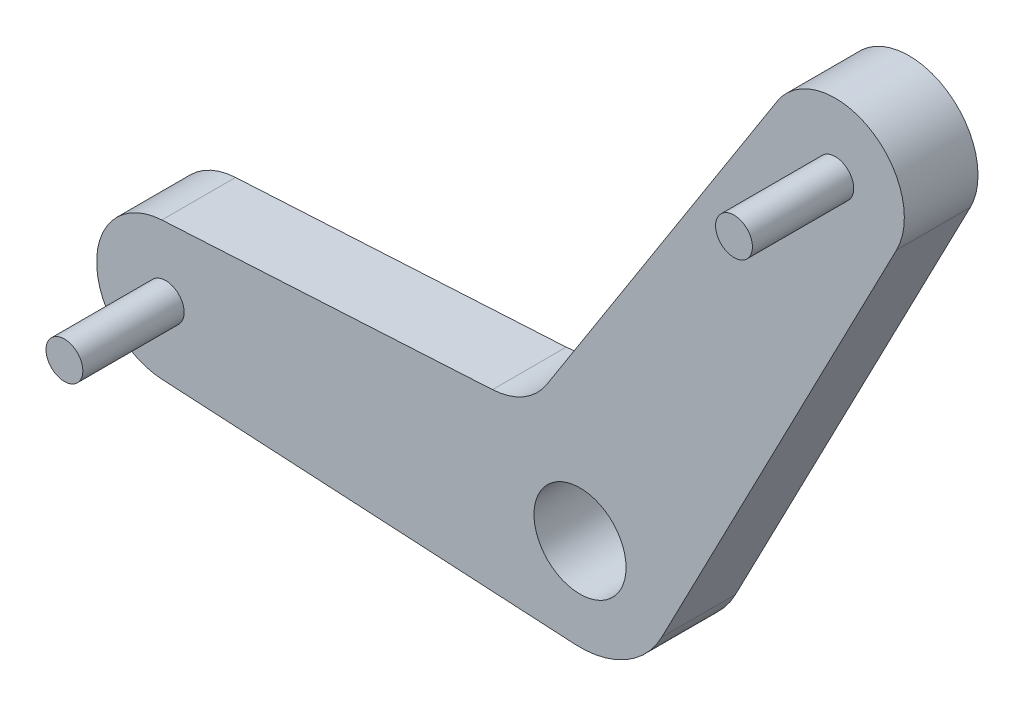
ISO-10303-21;
HEADER;
FILE_DESCRIPTION(('STEP AP214'),'2;1');
FILE_NAME('part.step','',(''),(''),'','','');
FILE_SCHEMA(('AUTOMOTIVE_DESIGN { 1 0 10303 214 1 1 1 1 }'));
ENDSEC;
DATA;
#1=APPLICATION_CONTEXT('core data for automotive mechanical design processes');
#2=APPLICATION_PROTOCOL_DEFINITION('international standard','automotive_design',2000,#1);
#3=PRODUCT_CONTEXT('',#1,'mechanical');
#4=PRODUCT('Part','Part','',(#3));
#5=PRODUCT_RELATED_PRODUCT_CATEGORY('part','',(#4));
#6=PRODUCT_DEFINITION_FORMATION('','',#4);
#7=PRODUCT_DEFINITION_CONTEXT('part definition',#1,'design');
#8=PRODUCT_DEFINITION('design','',#6,#7);
#9=PRODUCT_DEFINITION_SHAPE('','',#8);
#10=(LENGTH_UNIT() NAMED_UNIT(*) SI_UNIT(.MILLI.,.METRE.));
#11=(NAMED_UNIT(*) PLANE_ANGLE_UNIT() SI_UNIT($,.RADIAN.));
#12=(NAMED_UNIT(*) SI_UNIT($,.STERADIAN.) SOLID_ANGLE_UNIT());
#13=UNCERTAINTY_MEASURE_WITH_UNIT(LENGTH_MEASURE(1.E-05),#10,'distance_accuracy_value','');
#14=(GEOMETRIC_REPRESENTATION_CONTEXT(3) GLOBAL_UNCERTAINTY_ASSIGNED_CONTEXT((#13)) GLOBAL_UNIT_ASSIGNED_CONTEXT((#10,
#11,#12)) REPRESENTATION_CONTEXT('',''));
#15=CARTESIAN_POINT('',(0.,0.,0.));
#16=DIRECTION('',(0.,0.,1.));
#17=DIRECTION('',(1.,0.,0.));
#18=AXIS2_PLACEMENT_3D('',#15,#16,#17);
#19=CARTESIAN_POINT('',(-19.8391838862913,33.9502559764807,16.));
#20=DIRECTION('',(0.,0.,-1.));
#21=DIRECTION('',(-1.,0.,0.));
#22=AXIS2_PLACEMENT_3D('',#19,#20,#21);
#23=CYLINDRICAL_SURFACE('',#22,15.);
#24=CARTESIAN_POINT('',(-19.8391838862913,33.9502559764807,0.));
#25=DIRECTION('',(0.,0.,-1.));
#26=DIRECTION('',(-1.,0.,0.));
#27=AXIS2_PLACEMENT_3D('',#24,#25,#26);
#28=CIRCLE('',#27,15.);
#29=CARTESIAN_POINT('',(-7.20015490059572,25.8722026033748,0.));
#30=VERTEX_POINT('',#29);
#31=CARTESIAN_POINT('',(-19.005850552958,18.9734220134712,0.));
#32=VERTEX_POINT('',#31);
#33=EDGE_CURVE('E147',#30,#32,#28,.T.);
#34=ORIENTED_EDGE('',*,*,#33,.T.);
#35=DIRECTION('',(0.,0.,-1.));
#36=VECTOR('',#35,1.);
#37=CARTESIAN_POINT('',(-19.005850552958,18.9734220134712,16.));
#38=LINE('',#37,#36);
#39=CARTESIAN_POINT('',(-19.005850552958,18.9734220134712,16.));
#40=VERTEX_POINT('',#39);
#41=EDGE_CURVE('E189',#40,#32,#38,.T.);
#42=ORIENTED_EDGE('',*,*,#41,.F.);
#43=CARTESIAN_POINT('',(-19.8391838862913,33.9502559764807,16.));
#44=DIRECTION('',(0.,0.,-1.));
#45=DIRECTION('',(-1.,0.,0.));
#46=AXIS2_PLACEMENT_3D('',#43,#44,#45);
#47=CIRCLE('',#46,15.);
#48=CARTESIAN_POINT('',(-7.20015490059572,25.8722026033748,16.));
#49=VERTEX_POINT('',#48);
#50=EDGE_CURVE('E170',#49,#40,#47,.T.);
#51=ORIENTED_EDGE('',*,*,#50,.F.);
#52=DIRECTION('',(0.,0.,-1.));
#53=VECTOR('',#52,1.);
#54=CARTESIAN_POINT('',(-7.20015490059572,25.8722026033748,16.));
#55=LINE('',#54,#53);
#56=EDGE_CURVE('E143',#49,#30,#55,.T.);
#57=ORIENTED_EDGE('',*,*,#56,.T.);
#58=EDGE_LOOP('',(#34,#42,#51,#57));
#59=FACE_BOUND('',#58,.T.);
#60=ADVANCED_FACE('F45',(#59),#23,.F.);
#61=CARTESIAN_POINT('',(-90.8333333333333,14.9768339630095,16.));
#62=DIRECTION('',(0.0555555555555553,-0.998455597533968,0.));
#63=DIRECTION('',(0.998455597533968,0.0555555555555553,0.));
#64=AXIS2_PLACEMENT_3D('',#61,#62,#63);
#65=PLANE('',#64);
#66=DIRECTION('',(-0.998455597533968,-0.0555555555555553,0.));
#67=VECTOR('',#66,1.);
#68=CARTESIAN_POINT('',(-90.8333333333333,14.9768339630095,0.));
#69=LINE('',#68,#67);
#70=CARTESIAN_POINT('',(-90.8333333333333,14.9768339630095,0.));
#71=VERTEX_POINT('',#70);
#72=EDGE_CURVE('E151',#32,#71,#69,.T.);
#73=ORIENTED_EDGE('',*,*,#72,.T.);
#74=DIRECTION('',(0.,0.,-1.));
#75=VECTOR('',#74,1.);
#76=CARTESIAN_POINT('',(-90.8333333333333,14.9768339630095,16.));
#77=LINE('',#76,#75);
#78=CARTESIAN_POINT('',(-90.8333333333333,14.9768339630095,16.));
#79=VERTEX_POINT('',#78);
#80=EDGE_CURVE('E185',#79,#71,#77,.T.);
#81=ORIENTED_EDGE('',*,*,#80,.F.);
#82=DIRECTION('',(-0.998455597533968,-0.0555555555555553,0.));
#83=VECTOR('',#82,1.);
#84=CARTESIAN_POINT('',(-90.8333333333333,14.9768339630095,16.));
#85=LINE('',#84,#83);
#86=EDGE_CURVE('E106',#40,#79,#85,.T.);
#87=ORIENTED_EDGE('',*,*,#86,.F.);
#88=ORIENTED_EDGE('',*,*,#41,.T.);
#89=EDGE_LOOP('',(#73,#81,#87,#88));
#90=FACE_BOUND('',#89,.T.);
#91=ADVANCED_FACE('F214',(#90),#65,.F.);
#92=CARTESIAN_POINT('',(-90.,0.,16.));
#93=DIRECTION('',(0.,0.,-1.));
#94=DIRECTION('',(-1.,0.,0.));
#95=AXIS2_PLACEMENT_3D('',#92,#93,#94);
#96=CYLINDRICAL_SURFACE('',#95,15.);
#97=CARTESIAN_POINT('',(-90.,0.,0.));
#98=DIRECTION('',(0.,0.,1.));
#99=DIRECTION('',(1.,0.,0.));
#100=AXIS2_PLACEMENT_3D('',#97,#98,#99);
#101=CIRCLE('',#100,15.);
#102=CARTESIAN_POINT('',(-90.8333333333333,-14.9768339630095,0.));
#103=VERTEX_POINT('',#102);
#104=EDGE_CURVE('E155',#71,#103,#101,.T.);
#105=ORIENTED_EDGE('',*,*,#104,.T.);
#106=DIRECTION('',(0.,0.,-1.));
#107=VECTOR('',#106,1.);
#108=CARTESIAN_POINT('',(-90.8333333333333,-14.9768339630095,16.));
#109=LINE('',#108,#107);
#110=CARTESIAN_POINT('',(-90.8333333333333,-14.9768339630095,16.));
#111=VERTEX_POINT('',#110);
#112=EDGE_CURVE('E181',#111,#103,#109,.T.);
#113=ORIENTED_EDGE('',*,*,#112,.F.);
#114=CARTESIAN_POINT('',(-90.,0.,16.));
#115=DIRECTION('',(0.,0.,1.));
#116=DIRECTION('',(1.,0.,0.));
#117=AXIS2_PLACEMENT_3D('',#114,#115,#116);
#118=CIRCLE('',#117,15.);
#119=EDGE_CURVE('E229',#79,#111,#118,.T.);
#120=ORIENTED_EDGE('',*,*,#119,.F.);
#121=ORIENTED_EDGE('',*,*,#80,.T.);
#122=EDGE_LOOP('',(#105,#113,#120,#121));
#123=FACE_BOUND('',#122,.T.);
#124=ADVANCED_FACE('F219',(#123),#96,.T.);
#125=CARTESIAN_POINT('',(-90.8333333333333,-14.9768339630095,16.));
#126=DIRECTION('',(0.0555555555555556,0.998455597533968,0.));
#127=DIRECTION('',(-0.998455597533968,0.0555555555555556,0.));
#128=AXIS2_PLACEMENT_3D('',#125,#126,#127);
#129=PLANE('',#128);
#130=DIRECTION('',(0.998455597533968,-0.0555555555555556,0.));
#131=VECTOR('',#130,1.);
#132=CARTESIAN_POINT('',(-90.8333333333333,-14.9768339630095,0.));
#133=LINE('',#132,#131);
#134=CARTESIAN_POINT('',(-1.11111111111111,-19.9691119506794,0.));
#135=VERTEX_POINT('',#134);
#136=EDGE_CURVE('E158',#103,#135,#133,.T.);
#137=ORIENTED_EDGE('',*,*,#136,.T.);
#138=DIRECTION('',(0.,0.,-1.));
#139=VECTOR('',#138,1.);
#140=CARTESIAN_POINT('',(-1.11111111111111,-19.9691119506794,16.));
#141=LINE('',#140,#139);
#142=CARTESIAN_POINT('',(-1.11111111111111,-19.9691119506794,16.));
#143=VERTEX_POINT('',#142);
#144=EDGE_CURVE('E177',#143,#135,#141,.T.);
#145=ORIENTED_EDGE('',*,*,#144,.F.);
#146=DIRECTION('',(0.998455597533968,-0.0555555555555556,0.));
#147=VECTOR('',#146,1.);
#148=CARTESIAN_POINT('',(-90.8333333333333,-14.9768339630095,16.));
#149=LINE('',#148,#147);
#150=EDGE_CURVE('E232',#111,#143,#149,.T.);
#151=ORIENTED_EDGE('',*,*,#150,.F.);
#152=ORIENTED_EDGE('',*,*,#112,.T.);
#153=EDGE_LOOP('',(#137,#145,#151,#152));
#154=FACE_BOUND('',#153,.T.);
#155=ADVANCED_FACE('F340',(#154),#129,.F.);
#156=CARTESIAN_POINT('',(0.,0.,16.));
#157=DIRECTION('',(0.,0.,-1.));
#158=DIRECTION('',(-1.,0.,0.));
#159=AXIS2_PLACEMENT_3D('',#156,#157,#158);
#160=CYLINDRICAL_SURFACE('',#159,20.);
#161=CARTESIAN_POINT('',(0.,0.,0.));
#162=DIRECTION('',(0.,0.,1.));
#163=DIRECTION('',(1.,0.,0.));
#164=AXIS2_PLACEMENT_3D('',#161,#162,#163);
#165=CIRCLE('',#164,20.);
#166=CARTESIAN_POINT('',(17.7537519027789,-9.20892465896949,0.));
#167=VERTEX_POINT('',#166);
#168=EDGE_CURVE('E161',#135,#167,#165,.T.);
#169=ORIENTED_EDGE('',*,*,#168,.T.);
#170=DIRECTION('',(0.,0.,-1.));
#171=VECTOR('',#170,1.);
#172=CARTESIAN_POINT('',(17.7537519027789,-9.20892465896949,16.));
#173=LINE('',#172,#171);
#174=CARTESIAN_POINT('',(17.7537519027789,-9.20892465896949,16.));
#175=VERTEX_POINT('',#174);
#176=EDGE_CURVE('E136',#175,#167,#173,.T.);
#177=ORIENTED_EDGE('',*,*,#176,.F.);
#178=CARTESIAN_POINT('',(0.,0.,16.));
#179=DIRECTION('',(0.,0.,1.));
#180=DIRECTION('',(1.,0.,0.));
#181=AXIS2_PLACEMENT_3D('',#178,#179,#180);
#182=CIRCLE('',#181,20.);
#183=EDGE_CURVE('E125',#143,#175,#182,.T.);
#184=ORIENTED_EDGE('',*,*,#183,.F.);
#185=ORIENTED_EDGE('',*,*,#144,.T.);
#186=EDGE_LOOP('',(#169,#177,#184,#185));
#187=FACE_BOUND('',#186,.T.);
#188=ADVANCED_FACE('F332',(#187),#160,.T.);
#189=CARTESIAN_POINT('',(68.7653139270839,89.1355237854673,16.));
#190=DIRECTION('',(-0.887687595138943,0.460446232948474,0.));
#191=DIRECTION('',(-0.460446232948474,-0.887687595138943,0.));
#192=AXIS2_PLACEMENT_3D('',#189,#190,#191);
#193=PLANE('',#192);
#194=DIRECTION('',(0.460446232948474,0.887687595138943,0.));
#195=VECTOR('',#194,1.);
#196=CARTESIAN_POINT('',(68.7653139270839,89.1355237854673,0.));
#197=LINE('',#196,#195);
#198=CARTESIAN_POINT('',(68.7653139270839,89.1355237854673,0.));
#199=VERTEX_POINT('',#198);
#200=EDGE_CURVE('E134',#167,#199,#197,.T.);
#201=ORIENTED_EDGE('',*,*,#200,.T.);
#202=DIRECTION('',(0.,0.,-1.));
#203=VECTOR('',#202,1.);
#204=CARTESIAN_POINT('',(68.7653139270839,89.1355237854673,16.));
#205=LINE('',#204,#203);
#206=CARTESIAN_POINT('',(68.7653139270839,89.1355237854673,16.));
#207=VERTEX_POINT('',#206);
#208=EDGE_CURVE('E131',#207,#199,#205,.T.);
#209=ORIENTED_EDGE('',*,*,#208,.F.);
#210=DIRECTION('',(0.460446232948474,0.887687595138943,0.));
#211=VECTOR('',#210,1.);
#212=CARTESIAN_POINT('',(68.7653139270839,89.1355237854673,16.));
#213=LINE('',#212,#211);
#214=EDGE_CURVE('E119',#175,#207,#213,.T.);
#215=ORIENTED_EDGE('',*,*,#214,.F.);
#216=ORIENTED_EDGE('',*,*,#176,.T.);
#217=EDGE_LOOP('',(#201,#209,#215,#216));
#218=FACE_BOUND('',#217,.T.);
#219=ADVANCED_FACE('F132',(#218),#193,.F.);
#220=CARTESIAN_POINT('',(55.4499999999997,96.0422172796944,16.));
#221=DIRECTION('',(0.,0.,-1.));
#222=DIRECTION('',(-1.,0.,0.));
#223=AXIS2_PLACEMENT_3D('',#220,#221,#222);
#224=CYLINDRICAL_SURFACE('',#223,15.);
#225=CARTESIAN_POINT('',(55.4499999999997,96.0422172796944,0.));
#226=DIRECTION('',(0.,0.,1.));
#227=DIRECTION('',(1.,0.,0.));
#228=AXIS2_PLACEMENT_3D('',#225,#226,#227);
#229=CIRCLE('',#228,15.);
#230=CARTESIAN_POINT('',(42.8109710143043,104.1202706528,0.));
#231=VERTEX_POINT('',#230);
#232=EDGE_CURVE('E91',#199,#231,#229,.T.);
#233=ORIENTED_EDGE('',*,*,#232,.T.);
#234=DIRECTION('',(0.,0.,-1.));
#235=VECTOR('',#234,1.);
#236=CARTESIAN_POINT('',(42.8109710143043,104.1202706528,16.));
#237=LINE('',#236,#235);
#238=CARTESIAN_POINT('',(42.8109710143043,104.1202706528,16.));
#239=VERTEX_POINT('',#238);
#240=EDGE_CURVE('E137',#239,#231,#237,.T.);
#241=ORIENTED_EDGE('',*,*,#240,.F.);
#242=CARTESIAN_POINT('',(55.4499999999997,96.0422172796944,16.));
#243=DIRECTION('',(0.,0.,1.));
#244=DIRECTION('',(1.,0.,0.));
#245=AXIS2_PLACEMENT_3D('',#242,#243,#244);
#246=CIRCLE('',#245,15.);
#247=EDGE_CURVE('E123',#207,#239,#246,.T.);
#248=ORIENTED_EDGE('',*,*,#247,.F.);
#249=ORIENTED_EDGE('',*,*,#208,.T.);
#250=EDGE_LOOP('',(#233,#241,#248,#249));
#251=FACE_BOUND('',#250,.T.);
#252=ADVANCED_FACE('F139',(#251),#224,.T.);
#253=CARTESIAN_POINT('',(42.8109710143043,104.1202706528,16.));
#254=DIRECTION('',(0.8426019323797,-0.538536891540399,0.));
#255=DIRECTION('',(0.538536891540399,0.8426019323797,0.));
#256=AXIS2_PLACEMENT_3D('',#253,#254,#255);
#257=PLANE('',#256);
#258=DIRECTION('',(-0.538536891540399,-0.8426019323797,0.));
#259=VECTOR('',#258,1.);
#260=CARTESIAN_POINT('',(42.8109710143043,104.1202706528,0.));
#261=LINE('',#260,#259);
#262=EDGE_CURVE('E97',#231,#30,#261,.T.);
#263=ORIENTED_EDGE('',*,*,#262,.T.);
#264=ORIENTED_EDGE('',*,*,#56,.F.);
#265=DIRECTION('',(-0.538536891540399,-0.8426019323797,0.));
#266=VECTOR('',#265,1.);
#267=CARTESIAN_POINT('',(42.8109710143043,104.1202706528,16.));
#268=LINE('',#267,#266);
#269=EDGE_CURVE('E62',#239,#49,#268,.T.);
#270=ORIENTED_EDGE('',*,*,#269,.F.);
#271=ORIENTED_EDGE('',*,*,#240,.T.);
#272=EDGE_LOOP('',(#263,#264,#270,#271));
#273=FACE_BOUND('',#272,.T.);
#274=ADVANCED_FACE('F199',(#273),#257,.F.);
#275=CARTESIAN_POINT('',(-19.8391838862913,33.9502559764807,16.));
#276=DIRECTION('',(0.,0.,-1.));
#277=DIRECTION('',(-1.,0.,0.));
#278=AXIS2_PLACEMENT_3D('',#275,#276,#277);
#279=PLANE('',#278);
#280=CARTESIAN_POINT('',(0.,0.,16.));
#281=DIRECTION('',(0.,0.,1.));
#282=DIRECTION('',(1.,0.,0.));
#283=AXIS2_PLACEMENT_3D('',#280,#281,#282);
#284=CIRCLE('',#283,10.);
#285=CARTESIAN_POINT('',(10.,0.,16.));
#286=VERTEX_POINT('',#285);
#287=EDGE_CURVE('E246',#286,#286,#284,.T.);
#288=ORIENTED_EDGE('',*,*,#287,.F.);
#289=EDGE_LOOP('',(#288));
#290=FACE_BOUND('',#289,.T.);
#291=CARTESIAN_POINT('',(-90.,0.,16.));
#292=DIRECTION('',(0.,0.,-1.));
#293=DIRECTION('',(-1.,0.,0.));
#294=AXIS2_PLACEMENT_3D('',#291,#292,#293);
#295=CIRCLE('',#294,4.00000000000001);
#296=CARTESIAN_POINT('',(-94.,0.,16.));
#297=VERTEX_POINT('',#296);
#298=EDGE_CURVE('E11',#297,#297,#295,.F.);
#299=ORIENTED_EDGE('',*,*,#298,.F.);
#300=EDGE_LOOP('',(#299));
#301=FACE_BOUND('',#300,.T.);
#302=CARTESIAN_POINT('',(55.4499999999997,96.0422172796944,16.));
#303=DIRECTION('',(0.,0.,-1.));
#304=DIRECTION('',(-1.,0.,0.));
#305=AXIS2_PLACEMENT_3D('',#302,#303,#304);
#306=CIRCLE('',#305,4.00000000000001);
#307=CARTESIAN_POINT('',(51.4499999999997,96.0422172796944,16.));
#308=VERTEX_POINT('',#307);
#309=EDGE_CURVE('E54',#308,#308,#306,.F.);
#310=ORIENTED_EDGE('',*,*,#309,.F.);
#311=EDGE_LOOP('',(#310));
#312=FACE_BOUND('',#311,.T.);
#313=ORIENTED_EDGE('',*,*,#50,.T.);
#314=ORIENTED_EDGE('',*,*,#86,.T.);
#315=ORIENTED_EDGE('',*,*,#119,.T.);
#316=ORIENTED_EDGE('',*,*,#150,.T.);
#317=ORIENTED_EDGE('',*,*,#183,.T.);
#318=ORIENTED_EDGE('',*,*,#214,.T.);
#319=ORIENTED_EDGE('',*,*,#247,.T.);
#320=ORIENTED_EDGE('',*,*,#269,.T.);
#321=EDGE_LOOP('',(#313,#314,#315,#316,#317,#318,#319,#320));
#322=FACE_BOUND('',#321,.T.);
#323=ADVANCED_FACE('F121',(#290,#301,#312,#322),#279,.F.);
#324=CARTESIAN_POINT('',(-19.8391838862913,33.9502559764807,0.));
#325=DIRECTION('',(0.,0.,-1.));
#326=DIRECTION('',(-1.,0.,0.));
#327=AXIS2_PLACEMENT_3D('',#324,#325,#326);
#328=PLANE('',#327);
#329=CARTESIAN_POINT('',(0.,0.,0.));
#330=DIRECTION('',(0.,0.,1.));
#331=DIRECTION('',(1.,0.,0.));
#332=AXIS2_PLACEMENT_3D('',#329,#330,#331);
#333=CIRCLE('',#332,10.);
#334=CARTESIAN_POINT('',(10.,0.,0.));
#335=VERTEX_POINT('',#334);
#336=EDGE_CURVE('E250',#335,#335,#333,.T.);
#337=ORIENTED_EDGE('',*,*,#336,.T.);
#338=EDGE_LOOP('',(#337));
#339=FACE_BOUND('',#338,.T.);
#340=ORIENTED_EDGE('',*,*,#33,.F.);
#341=ORIENTED_EDGE('',*,*,#262,.F.);
#342=ORIENTED_EDGE('',*,*,#232,.F.);
#343=ORIENTED_EDGE('',*,*,#200,.F.);
#344=ORIENTED_EDGE('',*,*,#168,.F.);
#345=ORIENTED_EDGE('',*,*,#136,.F.);
#346=ORIENTED_EDGE('',*,*,#104,.F.);
#347=ORIENTED_EDGE('',*,*,#72,.F.);
#348=EDGE_LOOP('',(#340,#341,#342,#343,#344,#345,#346,#347));
#349=FACE_BOUND('',#348,.T.);
#350=ADVANCED_FACE('F198',(#339,#349),#328,.T.);
#351=CARTESIAN_POINT('',(55.4499999999997,96.0422172796944,38.));
#352=DIRECTION('',(0.,0.,-1.));
#353=DIRECTION('',(-1.,0.,0.));
#354=AXIS2_PLACEMENT_3D('',#351,#352,#353);
#355=CYLINDRICAL_SURFACE('',#354,4.00000000000001);
#356=CARTESIAN_POINT('',(55.4499999999997,96.0422172796944,38.));
#357=DIRECTION('',(0.,0.,1.));
#358=DIRECTION('',(1.,0.,0.));
#359=AXIS2_PLACEMENT_3D('',#356,#357,#358);
#360=CIRCLE('',#359,4.00000000000001);
#361=CARTESIAN_POINT('',(59.4499999999998,96.0422172796944,38.));
#362=VERTEX_POINT('',#361);
#363=EDGE_CURVE('E242',#362,#362,#360,.T.);
#364=ORIENTED_EDGE('',*,*,#363,.F.);
#365=EDGE_LOOP('',(#364));
#366=FACE_BOUND('',#365,.T.);
#367=ORIENTED_EDGE('',*,*,#309,.T.);
#368=EDGE_LOOP('',(#367));
#369=FACE_BOUND('',#368,.T.);
#370=ADVANCED_FACE('F195',(#366,#369),#355,.T.);
#371=CARTESIAN_POINT('',(55.4499999999997,96.0422172796944,38.));
#372=DIRECTION('',(0.,0.,1.));
#373=DIRECTION('',(1.,0.,0.));
#374=AXIS2_PLACEMENT_3D('',#371,#372,#373);
#375=PLANE('',#374);
#376=ORIENTED_EDGE('',*,*,#363,.T.);
#377=EDGE_LOOP('',(#376));
#378=FACE_BOUND('',#377,.T.);
#379=ADVANCED_FACE('F271',(#378),#375,.T.);
#380=CARTESIAN_POINT('',(-90.,0.,38.));
#381=DIRECTION('',(0.,0.,-1.));
#382=DIRECTION('',(-1.,0.,0.));
#383=AXIS2_PLACEMENT_3D('',#380,#381,#382);
#384=CYLINDRICAL_SURFACE('',#383,4.00000000000001);
#385=CARTESIAN_POINT('',(-90.,0.,38.));
#386=DIRECTION('',(0.,0.,1.));
#387=DIRECTION('',(1.,0.,0.));
#388=AXIS2_PLACEMENT_3D('',#385,#386,#387);
#389=CIRCLE('',#388,4.00000000000001);
#390=CARTESIAN_POINT('',(-86.,0.,38.));
#391=VERTEX_POINT('',#390);
#392=EDGE_CURVE('E152',#391,#391,#389,.T.);
#393=ORIENTED_EDGE('',*,*,#392,.F.);
#394=EDGE_LOOP('',(#393));
#395=FACE_BOUND('',#394,.T.);
#396=ORIENTED_EDGE('',*,*,#298,.T.);
#397=EDGE_LOOP('',(#396));
#398=FACE_BOUND('',#397,.T.);
#399=ADVANCED_FACE('F265',(#395,#398),#384,.T.);
#400=CARTESIAN_POINT('',(-90.,0.,38.));
#401=DIRECTION('',(0.,0.,1.));
#402=DIRECTION('',(1.,0.,0.));
#403=AXIS2_PLACEMENT_3D('',#400,#401,#402);
#404=PLANE('',#403);
#405=ORIENTED_EDGE('',*,*,#392,.T.);
#406=EDGE_LOOP('',(#405));
#407=FACE_BOUND('',#406,.T.);
#408=ADVANCED_FACE('F260',(#407),#404,.T.);
#409=CARTESIAN_POINT('',(0.,0.,16.));
#410=DIRECTION('',(0.,0.,-1.));
#411=DIRECTION('',(-1.,0.,0.));
#412=AXIS2_PLACEMENT_3D('',#409,#410,#411);
#413=CYLINDRICAL_SURFACE('',#412,10.);
#414=ORIENTED_EDGE('',*,*,#287,.T.);
#415=EDGE_LOOP('',(#414));
#416=FACE_BOUND('',#415,.T.);
#417=ORIENTED_EDGE('',*,*,#336,.F.);
#418=EDGE_LOOP('',(#417));
#419=FACE_BOUND('',#418,.T.);
#420=ADVANCED_FACE('F257',(#416,#419),#413,.F.);
#421=CLOSED_SHELL('',(#60,#91,#124,#155,#188,#219,#252,#274,#323,#350,#370,#379,#399,#408,#420));
#422=MANIFOLD_SOLID_BREP('B2',#421);
#423=ADVANCED_BREP_SHAPE_REPRESENTATION('',(#18,#422),#14);
#424=SHAPE_DEFINITION_REPRESENTATION(#9,#423);
ENDSEC;
END-ISO-10303-21;
